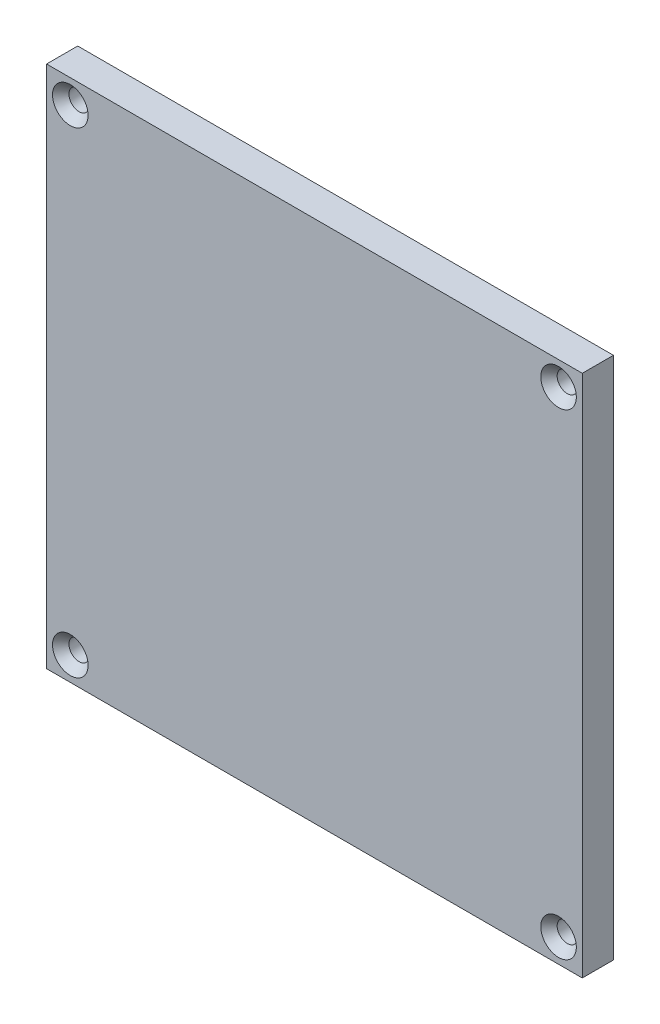
ISO-10303-21;
HEADER;
FILE_DESCRIPTION(('STEP AP214'),'2;1');
FILE_NAME('part.step','',(''),(''),'','','');
FILE_SCHEMA(('AUTOMOTIVE_DESIGN { 1 0 10303 214 1 1 1 1 }'));
ENDSEC;
DATA;
#1=APPLICATION_CONTEXT('core data for automotive mechanical design processes');
#2=APPLICATION_PROTOCOL_DEFINITION('international standard','automotive_design',2000,#1);
#3=PRODUCT_CONTEXT('',#1,'mechanical');
#4=PRODUCT('Part','Part','',(#3));
#5=PRODUCT_RELATED_PRODUCT_CATEGORY('part','',(#4));
#6=PRODUCT_DEFINITION_FORMATION('','',#4);
#7=PRODUCT_DEFINITION_CONTEXT('part definition',#1,'design');
#8=PRODUCT_DEFINITION('design','',#6,#7);
#9=PRODUCT_DEFINITION_SHAPE('','',#8);
#10=(LENGTH_UNIT() NAMED_UNIT(*) SI_UNIT(.MILLI.,.METRE.));
#11=(NAMED_UNIT(*) PLANE_ANGLE_UNIT() SI_UNIT($,.RADIAN.));
#12=(NAMED_UNIT(*) SI_UNIT($,.STERADIAN.) SOLID_ANGLE_UNIT());
#13=UNCERTAINTY_MEASURE_WITH_UNIT(LENGTH_MEASURE(1.E-05),#10,'distance_accuracy_value','');
#14=(GEOMETRIC_REPRESENTATION_CONTEXT(3) GLOBAL_UNCERTAINTY_ASSIGNED_CONTEXT((#13)) GLOBAL_UNIT_ASSIGNED_CONTEXT((#10,
#11,#12)) REPRESENTATION_CONTEXT('',''));
#15=CARTESIAN_POINT('',(0.,0.,0.));
#16=DIRECTION('',(0.,0.,1.));
#17=DIRECTION('',(1.,0.,0.));
#18=AXIS2_PLACEMENT_3D('',#15,#16,#17);
#19=CARTESIAN_POINT('',(0.,0.,4.999999906));
#20=DIRECTION('',(0.,0.,-1.));
#21=DIRECTION('',(-1.,0.,0.));
#22=AXIS2_PLACEMENT_3D('',#19,#20,#21);
#23=PLANE('',#22);
#24=CARTESIAN_POINT('',(39.189999852,38.227,4.999999906));
#25=DIRECTION('',(0.,0.,1.));
#26=DIRECTION('',(1.,0.,0.));
#27=AXIS2_PLACEMENT_3D('',#24,#25,#26);
#28=CIRCLE('',#27,2.8575);
#29=CARTESIAN_POINT('',(42.047499852,38.227,4.999999906));
#30=VERTEX_POINT('',#29);
#31=EDGE_CURVE('E134',#30,#30,#28,.T.);
#32=ORIENTED_EDGE('',*,*,#31,.F.);
#33=EDGE_LOOP('',(#32));
#34=FACE_BOUND('',#33,.T.);
#35=CARTESIAN_POINT('',(-39.189999852,-38.227,4.999999906));
#36=DIRECTION('',(0.,0.,1.));
#37=DIRECTION('',(1.,0.,0.));
#38=AXIS2_PLACEMENT_3D('',#35,#36,#37);
#39=CIRCLE('',#38,2.8575);
#40=CARTESIAN_POINT('',(-36.332499852,-38.227,4.999999906));
#41=VERTEX_POINT('',#40);
#42=EDGE_CURVE('E125',#41,#41,#39,.T.);
#43=ORIENTED_EDGE('',*,*,#42,.F.);
#44=EDGE_LOOP('',(#43));
#45=FACE_BOUND('',#44,.T.);
#46=CARTESIAN_POINT('',(39.189999852,-38.227,4.999999906));
#47=DIRECTION('',(0.,0.,1.));
#48=DIRECTION('',(1.,0.,0.));
#49=AXIS2_PLACEMENT_3D('',#46,#47,#48);
#50=CIRCLE('',#49,2.8575);
#51=CARTESIAN_POINT('',(42.047499852,-38.227,4.999999906));
#52=VERTEX_POINT('',#51);
#53=EDGE_CURVE('E116',#52,#52,#50,.T.);
#54=ORIENTED_EDGE('',*,*,#53,.F.);
#55=EDGE_LOOP('',(#54));
#56=FACE_BOUND('',#55,.T.);
#57=DIRECTION('',(0.,1.,0.));
#58=VECTOR('',#57,1.);
#59=CARTESIAN_POINT('',(42.999999852,-42.037,4.999999906));
#60=LINE('',#59,#58);
#61=CARTESIAN_POINT('',(42.999999852,-42.037,4.999999906));
#62=VERTEX_POINT('',#61);
#63=CARTESIAN_POINT('',(42.999999852,42.037,4.999999906));
#64=VERTEX_POINT('',#63);
#65=EDGE_CURVE('E85',#62,#64,#60,.T.);
#66=ORIENTED_EDGE('',*,*,#65,.T.);
#67=DIRECTION('',(-1.,0.,0.));
#68=VECTOR('',#67,1.);
#69=CARTESIAN_POINT('',(-42.999999852,42.037,4.999999906));
#70=LINE('',#69,#68);
#71=CARTESIAN_POINT('',(-42.999999852,42.037,4.999999906));
#72=VERTEX_POINT('',#71);
#73=EDGE_CURVE('E80',#64,#72,#70,.T.);
#74=ORIENTED_EDGE('',*,*,#73,.T.);
#75=DIRECTION('',(0.,-1.,0.));
#76=VECTOR('',#75,1.);
#77=CARTESIAN_POINT('',(-42.999999852,-42.037,4.999999906));
#78=LINE('',#77,#76);
#79=CARTESIAN_POINT('',(-42.999999852,-42.037,4.999999906));
#80=VERTEX_POINT('',#79);
#81=EDGE_CURVE('E83',#72,#80,#78,.T.);
#82=ORIENTED_EDGE('',*,*,#81,.T.);
#83=DIRECTION('',(1.,0.,0.));
#84=VECTOR('',#83,1.);
#85=CARTESIAN_POINT('',(-42.999999852,-42.037,4.999999906));
#86=LINE('',#85,#84);
#87=EDGE_CURVE('E50',#80,#62,#86,.T.);
#88=ORIENTED_EDGE('',*,*,#87,.T.);
#89=EDGE_LOOP('',(#66,#74,#82,#88));
#90=FACE_BOUND('',#89,.T.);
#91=CARTESIAN_POINT('',(-39.189999852,38.227,4.999999906));
#92=DIRECTION('',(0.,0.,1.));
#93=DIRECTION('',(1.,0.,0.));
#94=AXIS2_PLACEMENT_3D('',#91,#92,#93);
#95=CIRCLE('',#94,2.8575);
#96=CARTESIAN_POINT('',(-36.332499852,38.227,4.999999906));
#97=VERTEX_POINT('',#96);
#98=EDGE_CURVE('E143',#97,#97,#95,.T.);
#99=ORIENTED_EDGE('',*,*,#98,.F.);
#100=EDGE_LOOP('',(#99));
#101=FACE_BOUND('',#100,.T.);
#102=ADVANCED_FACE('F33',(#34,#45,#56,#90,#101),#23,.F.);
#103=CARTESIAN_POINT('',(42.999999852,-42.037,4.999999906));
#104=DIRECTION('',(-1.,0.,0.));
#105=DIRECTION('',(0.,0.,1.));
#106=AXIS2_PLACEMENT_3D('',#103,#104,#105);
#107=PLANE('',#106);
#108=DIRECTION('',(0.,1.,0.));
#109=VECTOR('',#108,1.);
#110=CARTESIAN_POINT('',(42.999999852,-42.037,0.));
#111=LINE('',#110,#109);
#112=CARTESIAN_POINT('',(42.999999852,-42.037,0.));
#113=VERTEX_POINT('',#112);
#114=CARTESIAN_POINT('',(42.999999852,42.037,0.));
#115=VERTEX_POINT('',#114);
#116=EDGE_CURVE('E97',#113,#115,#111,.T.);
#117=ORIENTED_EDGE('',*,*,#116,.T.);
#118=DIRECTION('',(0.,0.,-1.));
#119=VECTOR('',#118,1.);
#120=CARTESIAN_POINT('',(42.999999852,42.037,4.999999906));
#121=LINE('',#120,#119);
#122=EDGE_CURVE('E11',#64,#115,#121,.T.);
#123=ORIENTED_EDGE('',*,*,#122,.F.);
#124=ORIENTED_EDGE('',*,*,#65,.F.);
#125=DIRECTION('',(0.,0.,-1.));
#126=VECTOR('',#125,1.);
#127=CARTESIAN_POINT('',(42.999999852,-42.037,4.999999906));
#128=LINE('',#127,#126);
#129=EDGE_CURVE('E93',#62,#113,#128,.T.);
#130=ORIENTED_EDGE('',*,*,#129,.T.);
#131=EDGE_LOOP('',(#117,#123,#124,#130));
#132=FACE_BOUND('',#131,.T.);
#133=ADVANCED_FACE('F35',(#132),#107,.F.);
#134=CARTESIAN_POINT('',(-42.999999852,42.037,4.999999906));
#135=DIRECTION('',(0.,-1.,0.));
#136=DIRECTION('',(0.,0.,-1.));
#137=AXIS2_PLACEMENT_3D('',#134,#135,#136);
#138=PLANE('',#137);
#139=DIRECTION('',(-1.,0.,0.));
#140=VECTOR('',#139,1.);
#141=CARTESIAN_POINT('',(-42.999999852,42.037,0.));
#142=LINE('',#141,#140);
#143=CARTESIAN_POINT('',(-42.999999852,42.037,0.));
#144=VERTEX_POINT('',#143);
#145=EDGE_CURVE('E89',#115,#144,#142,.T.);
#146=ORIENTED_EDGE('',*,*,#145,.T.);
#147=DIRECTION('',(0.,0.,-1.));
#148=VECTOR('',#147,1.);
#149=CARTESIAN_POINT('',(-42.999999852,42.037,4.999999906));
#150=LINE('',#149,#148);
#151=EDGE_CURVE('E42',#72,#144,#150,.T.);
#152=ORIENTED_EDGE('',*,*,#151,.F.);
#153=ORIENTED_EDGE('',*,*,#73,.F.);
#154=ORIENTED_EDGE('',*,*,#122,.T.);
#155=EDGE_LOOP('',(#146,#152,#153,#154));
#156=FACE_BOUND('',#155,.T.);
#157=ADVANCED_FACE('F88',(#156),#138,.F.);
#158=CARTESIAN_POINT('',(-42.999999852,-42.037,4.999999906));
#159=DIRECTION('',(1.,0.,0.));
#160=DIRECTION('',(0.,0.,-1.));
#161=AXIS2_PLACEMENT_3D('',#158,#159,#160);
#162=PLANE('',#161);
#163=DIRECTION('',(0.,-1.,0.));
#164=VECTOR('',#163,1.);
#165=CARTESIAN_POINT('',(-42.999999852,-42.037,0.));
#166=LINE('',#165,#164);
#167=CARTESIAN_POINT('',(-42.999999852,-42.037,0.));
#168=VERTEX_POINT('',#167);
#169=EDGE_CURVE('E67',#144,#168,#166,.T.);
#170=ORIENTED_EDGE('',*,*,#169,.T.);
#171=DIRECTION('',(0.,0.,-1.));
#172=VECTOR('',#171,1.);
#173=CARTESIAN_POINT('',(-42.999999852,-42.037,4.999999906));
#174=LINE('',#173,#172);
#175=EDGE_CURVE('E90',#80,#168,#174,.T.);
#176=ORIENTED_EDGE('',*,*,#175,.F.);
#177=ORIENTED_EDGE('',*,*,#81,.F.);
#178=ORIENTED_EDGE('',*,*,#151,.T.);
#179=EDGE_LOOP('',(#170,#176,#177,#178));
#180=FACE_BOUND('',#179,.T.);
#181=ADVANCED_FACE('F91',(#180),#162,.F.);
#182=CARTESIAN_POINT('',(-42.999999852,-42.037,4.999999906));
#183=DIRECTION('',(0.,1.,0.));
#184=DIRECTION('',(0.,0.,1.));
#185=AXIS2_PLACEMENT_3D('',#182,#183,#184);
#186=PLANE('',#185);
#187=DIRECTION('',(1.,0.,0.));
#188=VECTOR('',#187,1.);
#189=CARTESIAN_POINT('',(-42.999999852,-42.037,0.));
#190=LINE('',#189,#188);
#191=EDGE_CURVE('E73',#168,#113,#190,.T.);
#192=ORIENTED_EDGE('',*,*,#191,.T.);
#193=ORIENTED_EDGE('',*,*,#129,.F.);
#194=ORIENTED_EDGE('',*,*,#87,.F.);
#195=ORIENTED_EDGE('',*,*,#175,.T.);
#196=EDGE_LOOP('',(#192,#193,#194,#195));
#197=FACE_BOUND('',#196,.T.);
#198=ADVANCED_FACE('F105',(#197),#186,.F.);
#199=CARTESIAN_POINT('',(0.,0.,0.));
#200=DIRECTION('',(0.,0.,-1.));
#201=DIRECTION('',(-1.,0.,0.));
#202=AXIS2_PLACEMENT_3D('',#199,#200,#201);
#203=PLANE('',#202);
#204=CARTESIAN_POINT('',(-39.189999852,38.227,0.));
#205=DIRECTION('',(0.,0.,-1.));
#206=DIRECTION('',(-1.,0.,0.));
#207=AXIS2_PLACEMENT_3D('',#204,#205,#206);
#208=CIRCLE('',#207,1.63195);
#209=CARTESIAN_POINT('',(-40.821949852,38.227,0.));
#210=VERTEX_POINT('',#209);
#211=EDGE_CURVE('E137',#210,#210,#208,.T.);
#212=ORIENTED_EDGE('',*,*,#211,.F.);
#213=EDGE_LOOP('',(#212));
#214=FACE_BOUND('',#213,.T.);
#215=CARTESIAN_POINT('',(39.189999852,38.227,0.));
#216=DIRECTION('',(0.,0.,-1.));
#217=DIRECTION('',(-1.,0.,0.));
#218=AXIS2_PLACEMENT_3D('',#215,#216,#217);
#219=CIRCLE('',#218,1.63195);
#220=CARTESIAN_POINT('',(37.558049852,38.227,0.));
#221=VERTEX_POINT('',#220);
#222=EDGE_CURVE('E128',#221,#221,#219,.T.);
#223=ORIENTED_EDGE('',*,*,#222,.F.);
#224=EDGE_LOOP('',(#223));
#225=FACE_BOUND('',#224,.T.);
#226=CARTESIAN_POINT('',(-39.189999852,-38.227,0.));
#227=DIRECTION('',(0.,0.,-1.));
#228=DIRECTION('',(-1.,0.,0.));
#229=AXIS2_PLACEMENT_3D('',#226,#227,#228);
#230=CIRCLE('',#229,1.63195);
#231=CARTESIAN_POINT('',(-40.821949852,-38.227,0.));
#232=VERTEX_POINT('',#231);
#233=EDGE_CURVE('E119',#232,#232,#230,.T.);
#234=ORIENTED_EDGE('',*,*,#233,.F.);
#235=EDGE_LOOP('',(#234));
#236=FACE_BOUND('',#235,.T.);
#237=CARTESIAN_POINT('',(39.189999852,-38.227,0.));
#238=DIRECTION('',(0.,0.,-1.));
#239=DIRECTION('',(-1.,0.,0.));
#240=AXIS2_PLACEMENT_3D('',#237,#238,#239);
#241=CIRCLE('',#240,1.63195);
#242=CARTESIAN_POINT('',(37.558049852,-38.227,0.));
#243=VERTEX_POINT('',#242);
#244=EDGE_CURVE('E100',#243,#243,#241,.T.);
#245=ORIENTED_EDGE('',*,*,#244,.F.);
#246=EDGE_LOOP('',(#245));
#247=FACE_BOUND('',#246,.T.);
#248=ORIENTED_EDGE('',*,*,#116,.F.);
#249=ORIENTED_EDGE('',*,*,#191,.F.);
#250=ORIENTED_EDGE('',*,*,#169,.F.);
#251=ORIENTED_EDGE('',*,*,#145,.F.);
#252=EDGE_LOOP('',(#248,#249,#250,#251));
#253=FACE_BOUND('',#252,.T.);
#254=ADVANCED_FACE('F108',(#214,#225,#236,#247,#253),#203,.T.);
#255=CARTESIAN_POINT('',(39.189999852,-38.227,4.999999906));
#256=DIRECTION('',(0.,0.,1.));
#257=DIRECTION('',(1.,0.,0.));
#258=AXIS2_PLACEMENT_3D('',#255,#256,#257);
#259=CYLINDRICAL_SURFACE('',#258,1.63195);
#260=CARTESIAN_POINT('',(39.189999852,-38.227,3.59016590453029));
#261=DIRECTION('',(0.,0.,1.));
#262=DIRECTION('',(1.,0.,0.));
#263=AXIS2_PLACEMENT_3D('',#260,#261,#262);
#264=CIRCLE('',#263,1.63195);
#265=CARTESIAN_POINT('',(40.821949852,-38.227,3.59016590453029));
#266=VERTEX_POINT('',#265);
#267=EDGE_CURVE('E113',#266,#266,#264,.T.);
#268=ORIENTED_EDGE('',*,*,#267,.T.);
#269=EDGE_LOOP('',(#268));
#270=FACE_BOUND('',#269,.T.);
#271=ORIENTED_EDGE('',*,*,#244,.T.);
#272=EDGE_LOOP('',(#271));
#273=FACE_BOUND('',#272,.T.);
#274=ADVANCED_FACE('F158',(#270,#273),#259,.F.);
#275=CARTESIAN_POINT('',(39.189999852,-38.227,4.999999906));
#276=DIRECTION('',(0.,0.,1.));
#277=DIRECTION('',(1.,0.,0.));
#278=AXIS2_PLACEMENT_3D('',#275,#276,#277);
#279=CONICAL_SURFACE('',#278,2.8575,0.715584993317674);
#280=ORIENTED_EDGE('',*,*,#267,.F.);
#281=EDGE_LOOP('',(#280));
#282=FACE_BOUND('',#281,.T.);
#283=ORIENTED_EDGE('',*,*,#53,.T.);
#284=EDGE_LOOP('',(#283));
#285=FACE_BOUND('',#284,.T.);
#286=ADVANCED_FACE('F189',(#282,#285),#279,.F.);
#287=CARTESIAN_POINT('',(-39.189999852,-38.227,4.999999906));
#288=DIRECTION('',(0.,0.,1.));
#289=DIRECTION('',(1.,0.,0.));
#290=AXIS2_PLACEMENT_3D('',#287,#288,#289);
#291=CYLINDRICAL_SURFACE('',#290,1.63195);
#292=CARTESIAN_POINT('',(-39.189999852,-38.227,3.59016590453029));
#293=DIRECTION('',(0.,0.,1.));
#294=DIRECTION('',(1.,0.,0.));
#295=AXIS2_PLACEMENT_3D('',#292,#293,#294);
#296=CIRCLE('',#295,1.63195);
#297=CARTESIAN_POINT('',(-37.558049852,-38.227,3.59016590453029));
#298=VERTEX_POINT('',#297);
#299=EDGE_CURVE('E122',#298,#298,#296,.T.);
#300=ORIENTED_EDGE('',*,*,#299,.T.);
#301=EDGE_LOOP('',(#300));
#302=FACE_BOUND('',#301,.T.);
#303=ORIENTED_EDGE('',*,*,#233,.T.);
#304=EDGE_LOOP('',(#303));
#305=FACE_BOUND('',#304,.T.);
#306=ADVANCED_FACE('F196',(#302,#305),#291,.F.);
#307=CARTESIAN_POINT('',(-39.189999852,-38.227,4.999999906));
#308=DIRECTION('',(0.,0.,1.));
#309=DIRECTION('',(1.,0.,0.));
#310=AXIS2_PLACEMENT_3D('',#307,#308,#309);
#311=CONICAL_SURFACE('',#310,2.8575,0.715584993317674);
#312=ORIENTED_EDGE('',*,*,#299,.F.);
#313=EDGE_LOOP('',(#312));
#314=FACE_BOUND('',#313,.T.);
#315=ORIENTED_EDGE('',*,*,#42,.T.);
#316=EDGE_LOOP('',(#315));
#317=FACE_BOUND('',#316,.T.);
#318=ADVANCED_FACE('F203',(#314,#317),#311,.F.);
#319=CARTESIAN_POINT('',(39.189999852,38.227,4.999999906));
#320=DIRECTION('',(0.,0.,1.));
#321=DIRECTION('',(1.,0.,0.));
#322=AXIS2_PLACEMENT_3D('',#319,#320,#321);
#323=CYLINDRICAL_SURFACE('',#322,1.63195);
#324=CARTESIAN_POINT('',(39.189999852,38.227,3.59016590453029));
#325=DIRECTION('',(0.,0.,1.));
#326=DIRECTION('',(1.,0.,0.));
#327=AXIS2_PLACEMENT_3D('',#324,#325,#326);
#328=CIRCLE('',#327,1.63195);
#329=CARTESIAN_POINT('',(40.821949852,38.227,3.59016590453029));
#330=VERTEX_POINT('',#329);
#331=EDGE_CURVE('E131',#330,#330,#328,.T.);
#332=ORIENTED_EDGE('',*,*,#331,.T.);
#333=EDGE_LOOP('',(#332));
#334=FACE_BOUND('',#333,.T.);
#335=ORIENTED_EDGE('',*,*,#222,.T.);
#336=EDGE_LOOP('',(#335));
#337=FACE_BOUND('',#336,.T.);
#338=ADVANCED_FACE('F211',(#334,#337),#323,.F.);
#339=CARTESIAN_POINT('',(39.189999852,38.227,4.999999906));
#340=DIRECTION('',(0.,0.,1.));
#341=DIRECTION('',(1.,0.,0.));
#342=AXIS2_PLACEMENT_3D('',#339,#340,#341);
#343=CONICAL_SURFACE('',#342,2.8575,0.715584993317674);
#344=ORIENTED_EDGE('',*,*,#331,.F.);
#345=EDGE_LOOP('',(#344));
#346=FACE_BOUND('',#345,.T.);
#347=ORIENTED_EDGE('',*,*,#31,.T.);
#348=EDGE_LOOP('',(#347));
#349=FACE_BOUND('',#348,.T.);
#350=ADVANCED_FACE('F219',(#346,#349),#343,.F.);
#351=CARTESIAN_POINT('',(-39.189999852,38.227,4.999999906));
#352=DIRECTION('',(0.,0.,1.));
#353=DIRECTION('',(1.,0.,0.));
#354=AXIS2_PLACEMENT_3D('',#351,#352,#353);
#355=CYLINDRICAL_SURFACE('',#354,1.63195);
#356=CARTESIAN_POINT('',(-39.189999852,38.227,3.59016590453029));
#357=DIRECTION('',(0.,0.,1.));
#358=DIRECTION('',(1.,0.,0.));
#359=AXIS2_PLACEMENT_3D('',#356,#357,#358);
#360=CIRCLE('',#359,1.63195);
#361=CARTESIAN_POINT('',(-37.558049852,38.227,3.59016590453029));
#362=VERTEX_POINT('',#361);
#363=EDGE_CURVE('E140',#362,#362,#360,.T.);
#364=ORIENTED_EDGE('',*,*,#363,.T.);
#365=EDGE_LOOP('',(#364));
#366=FACE_BOUND('',#365,.T.);
#367=ORIENTED_EDGE('',*,*,#211,.T.);
#368=EDGE_LOOP('',(#367));
#369=FACE_BOUND('',#368,.T.);
#370=ADVANCED_FACE('F227',(#366,#369),#355,.F.);
#371=CARTESIAN_POINT('',(-39.189999852,38.227,4.999999906));
#372=DIRECTION('',(0.,0.,1.));
#373=DIRECTION('',(1.,0.,0.));
#374=AXIS2_PLACEMENT_3D('',#371,#372,#373);
#375=CONICAL_SURFACE('',#374,2.8575,0.715584993317674);
#376=ORIENTED_EDGE('',*,*,#363,.F.);
#377=EDGE_LOOP('',(#376));
#378=FACE_BOUND('',#377,.T.);
#379=ORIENTED_EDGE('',*,*,#98,.T.);
#380=EDGE_LOOP('',(#379));
#381=FACE_BOUND('',#380,.T.);
#382=ADVANCED_FACE('F147',(#378,#381),#375,.F.);
#383=CLOSED_SHELL('',(#102,#133,#157,#181,#198,#254,#274,#286,#306,#318,#338,#350,#370,#382));
#384=MANIFOLD_SOLID_BREP('B2',#383);
#385=ADVANCED_BREP_SHAPE_REPRESENTATION('',(#18,#384),#14);
#386=SHAPE_DEFINITION_REPRESENTATION(#9,#385);
ENDSEC;
END-ISO-10303-21;
